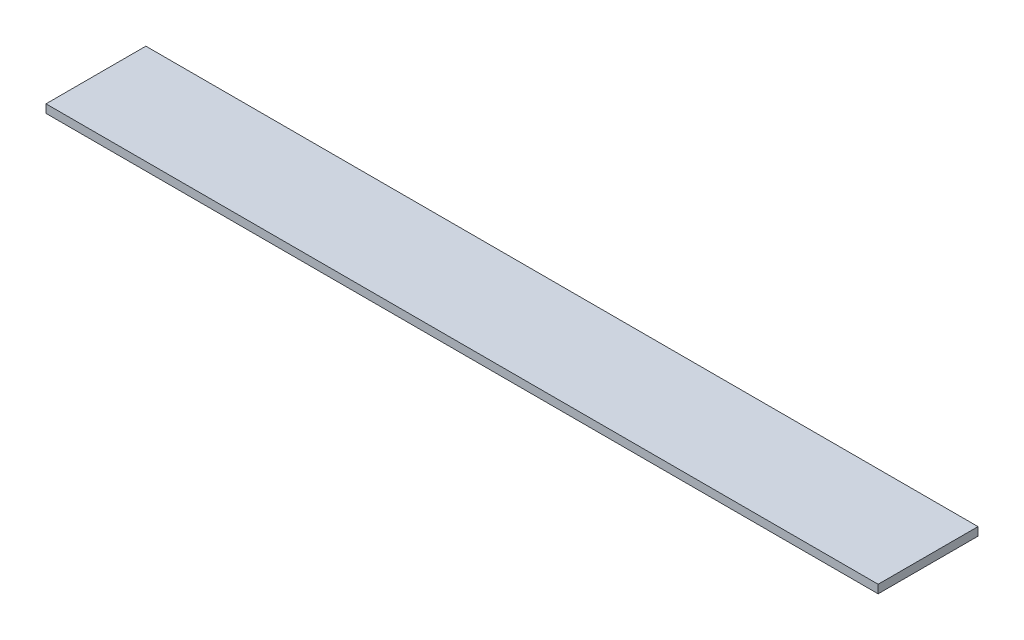
ISO-10303-21;
HEADER;
FILE_DESCRIPTION(('STEP AP214'),'2;1');
FILE_NAME('part.step','',(''),(''),'','','');
FILE_SCHEMA(('AUTOMOTIVE_DESIGN { 1 0 10303 214 1 1 1 1 }'));
ENDSEC;
DATA;
#1=APPLICATION_CONTEXT('core data for automotive mechanical design processes');
#2=APPLICATION_PROTOCOL_DEFINITION('international standard','automotive_design',2000,#1);
#3=PRODUCT_CONTEXT('',#1,'mechanical');
#4=PRODUCT('Part','Part','',(#3));
#5=PRODUCT_RELATED_PRODUCT_CATEGORY('part','',(#4));
#6=PRODUCT_DEFINITION_FORMATION('','',#4);
#7=PRODUCT_DEFINITION_CONTEXT('part definition',#1,'design');
#8=PRODUCT_DEFINITION('design','',#6,#7);
#9=PRODUCT_DEFINITION_SHAPE('','',#8);
#10=(LENGTH_UNIT() NAMED_UNIT(*) SI_UNIT(.MILLI.,.METRE.));
#11=(NAMED_UNIT(*) PLANE_ANGLE_UNIT() SI_UNIT($,.RADIAN.));
#12=(NAMED_UNIT(*) SI_UNIT($,.STERADIAN.) SOLID_ANGLE_UNIT());
#13=UNCERTAINTY_MEASURE_WITH_UNIT(LENGTH_MEASURE(1.E-05),#10,'distance_accuracy_value','');
#14=(GEOMETRIC_REPRESENTATION_CONTEXT(3) GLOBAL_UNCERTAINTY_ASSIGNED_CONTEXT((#13)) GLOBAL_UNIT_ASSIGNED_CONTEXT((#10,
#11,#12)) REPRESENTATION_CONTEXT('',''));
#15=CARTESIAN_POINT('',(0.,0.,0.));
#16=DIRECTION('',(0.,0.,1.));
#17=DIRECTION('',(1.,0.,0.));
#18=AXIS2_PLACEMENT_3D('',#15,#16,#17);
#19=CARTESIAN_POINT('',(0.,0.5,0.));
#20=DIRECTION('',(1.,0.,0.));
#21=DIRECTION('',(0.,0.,-1.));
#22=AXIS2_PLACEMENT_3D('',#19,#20,#21);
#23=PLANE('',#22);
#24=DIRECTION('',(0.,0.,1.));
#25=VECTOR('',#24,1.);
#26=CARTESIAN_POINT('',(0.,0.,0.));
#27=LINE('',#26,#25);
#28=CARTESIAN_POINT('',(0.,0.,-6.));
#29=VERTEX_POINT('',#28);
#30=CARTESIAN_POINT('',(0.,0.,0.));
#31=VERTEX_POINT('',#30);
#32=EDGE_CURVE('E96',#29,#31,#27,.T.);
#33=ORIENTED_EDGE('',*,*,#32,.T.);
#34=DIRECTION('',(0.,-1.,0.));
#35=VECTOR('',#34,1.);
#36=CARTESIAN_POINT('',(0.,0.5,0.));
#37=LINE('',#36,#35);
#38=CARTESIAN_POINT('',(0.,0.5,0.));
#39=VERTEX_POINT('',#38);
#40=EDGE_CURVE('E11',#39,#31,#37,.T.);
#41=ORIENTED_EDGE('',*,*,#40,.F.);
#42=DIRECTION('',(0.,0.,1.));
#43=VECTOR('',#42,1.);
#44=CARTESIAN_POINT('',(0.,0.5,0.));
#45=LINE('',#44,#43);
#46=CARTESIAN_POINT('',(0.,0.5,-6.));
#47=VERTEX_POINT('',#46);
#48=EDGE_CURVE('E84',#47,#39,#45,.T.);
#49=ORIENTED_EDGE('',*,*,#48,.F.);
#50=DIRECTION('',(0.,-1.,0.));
#51=VECTOR('',#50,1.);
#52=CARTESIAN_POINT('',(0.,0.5,-6.));
#53=LINE('',#52,#51);
#54=EDGE_CURVE('E92',#47,#29,#53,.T.);
#55=ORIENTED_EDGE('',*,*,#54,.T.);
#56=EDGE_LOOP('',(#33,#41,#49,#55));
#57=FACE_BOUND('',#56,.T.);
#58=ADVANCED_FACE('F33',(#57),#23,.F.);
#59=CARTESIAN_POINT('',(0.,0.5,0.));
#60=DIRECTION('',(0.,0.,-1.));
#61=DIRECTION('',(-1.,0.,0.));
#62=AXIS2_PLACEMENT_3D('',#59,#60,#61);
#63=PLANE('',#62);
#64=DIRECTION('',(1.,0.,0.));
#65=VECTOR('',#64,1.);
#66=CARTESIAN_POINT('',(0.,0.,0.));
#67=LINE('',#66,#65);
#68=CARTESIAN_POINT('',(50.,0.,0.));
#69=VERTEX_POINT('',#68);
#70=EDGE_CURVE('E88',#31,#69,#67,.T.);
#71=ORIENTED_EDGE('',*,*,#70,.T.);
#72=DIRECTION('',(0.,-1.,0.));
#73=VECTOR('',#72,1.);
#74=CARTESIAN_POINT('',(50.,0.5,0.));
#75=LINE('',#74,#73);
#76=CARTESIAN_POINT('',(50.,0.5,0.));
#77=VERTEX_POINT('',#76);
#78=EDGE_CURVE('E41',#77,#69,#75,.T.);
#79=ORIENTED_EDGE('',*,*,#78,.F.);
#80=DIRECTION('',(1.,0.,0.));
#81=VECTOR('',#80,1.);
#82=CARTESIAN_POINT('',(0.,0.5,0.));
#83=LINE('',#82,#81);
#84=EDGE_CURVE('E79',#39,#77,#83,.T.);
#85=ORIENTED_EDGE('',*,*,#84,.F.);
#86=ORIENTED_EDGE('',*,*,#40,.T.);
#87=EDGE_LOOP('',(#71,#79,#85,#86));
#88=FACE_BOUND('',#87,.T.);
#89=ADVANCED_FACE('F87',(#88),#63,.F.);
#90=CARTESIAN_POINT('',(50.,0.5,0.));
#91=DIRECTION('',(-1.,0.,0.));
#92=DIRECTION('',(0.,0.,1.));
#93=AXIS2_PLACEMENT_3D('',#90,#91,#92);
#94=PLANE('',#93);
#95=DIRECTION('',(0.,0.,-1.));
#96=VECTOR('',#95,1.);
#97=CARTESIAN_POINT('',(50.,0.,0.));
#98=LINE('',#97,#96);
#99=CARTESIAN_POINT('',(50.,0.,-6.));
#100=VERTEX_POINT('',#99);
#101=EDGE_CURVE('E66',#69,#100,#98,.T.);
#102=ORIENTED_EDGE('',*,*,#101,.T.);
#103=DIRECTION('',(0.,-1.,0.));
#104=VECTOR('',#103,1.);
#105=CARTESIAN_POINT('',(50.,0.5,-6.));
#106=LINE('',#105,#104);
#107=CARTESIAN_POINT('',(50.,0.5,-6.));
#108=VERTEX_POINT('',#107);
#109=EDGE_CURVE('E89',#108,#100,#106,.T.);
#110=ORIENTED_EDGE('',*,*,#109,.F.);
#111=DIRECTION('',(0.,0.,-1.));
#112=VECTOR('',#111,1.);
#113=CARTESIAN_POINT('',(50.,0.5,0.));
#114=LINE('',#113,#112);
#115=EDGE_CURVE('E82',#77,#108,#114,.T.);
#116=ORIENTED_EDGE('',*,*,#115,.F.);
#117=ORIENTED_EDGE('',*,*,#78,.T.);
#118=EDGE_LOOP('',(#102,#110,#116,#117));
#119=FACE_BOUND('',#118,.T.);
#120=ADVANCED_FACE('F90',(#119),#94,.F.);
#121=CARTESIAN_POINT('',(0.,0.5,-6.));
#122=DIRECTION('',(0.,0.,1.));
#123=DIRECTION('',(1.,0.,0.));
#124=AXIS2_PLACEMENT_3D('',#121,#122,#123);
#125=PLANE('',#124);
#126=DIRECTION('',(-1.,0.,0.));
#127=VECTOR('',#126,1.);
#128=CARTESIAN_POINT('',(0.,0.,-6.));
#129=LINE('',#128,#127);
#130=EDGE_CURVE('E72',#100,#29,#129,.T.);
#131=ORIENTED_EDGE('',*,*,#130,.T.);
#132=ORIENTED_EDGE('',*,*,#54,.F.);
#133=DIRECTION('',(-1.,0.,0.));
#134=VECTOR('',#133,1.);
#135=CARTESIAN_POINT('',(0.,0.5,-6.));
#136=LINE('',#135,#134);
#137=EDGE_CURVE('E49',#108,#47,#136,.T.);
#138=ORIENTED_EDGE('',*,*,#137,.F.);
#139=ORIENTED_EDGE('',*,*,#109,.T.);
#140=EDGE_LOOP('',(#131,#132,#138,#139));
#141=FACE_BOUND('',#140,.T.);
#142=ADVANCED_FACE('F103',(#141),#125,.F.);
#143=CARTESIAN_POINT('',(0.,0.5,0.));
#144=DIRECTION('',(0.,-1.,0.));
#145=DIRECTION('',(0.,0.,-1.));
#146=AXIS2_PLACEMENT_3D('',#143,#144,#145);
#147=PLANE('',#146);
#148=ORIENTED_EDGE('',*,*,#48,.T.);
#149=ORIENTED_EDGE('',*,*,#84,.T.);
#150=ORIENTED_EDGE('',*,*,#115,.T.);
#151=ORIENTED_EDGE('',*,*,#137,.T.);
#152=EDGE_LOOP('',(#148,#149,#150,#151));
#153=FACE_BOUND('',#152,.T.);
#154=ADVANCED_FACE('F80',(#153),#147,.F.);
#155=CARTESIAN_POINT('',(0.,0.,0.));
#156=DIRECTION('',(0.,-1.,0.));
#157=DIRECTION('',(0.,0.,-1.));
#158=AXIS2_PLACEMENT_3D('',#155,#156,#157);
#159=PLANE('',#158);
#160=ORIENTED_EDGE('',*,*,#32,.F.);
#161=ORIENTED_EDGE('',*,*,#130,.F.);
#162=ORIENTED_EDGE('',*,*,#101,.F.);
#163=ORIENTED_EDGE('',*,*,#70,.F.);
#164=EDGE_LOOP('',(#160,#161,#162,#163));
#165=FACE_BOUND('',#164,.T.);
#166=ADVANCED_FACE('F106',(#165),#159,.T.);
#167=CLOSED_SHELL('',(#58,#89,#120,#142,#154,#166));
#168=MANIFOLD_SOLID_BREP('B2',#167);
#169=ADVANCED_BREP_SHAPE_REPRESENTATION('',(#18,#168),#14);
#170=SHAPE_DEFINITION_REPRESENTATION(#9,#169);
ENDSEC;
END-ISO-10303-21;
